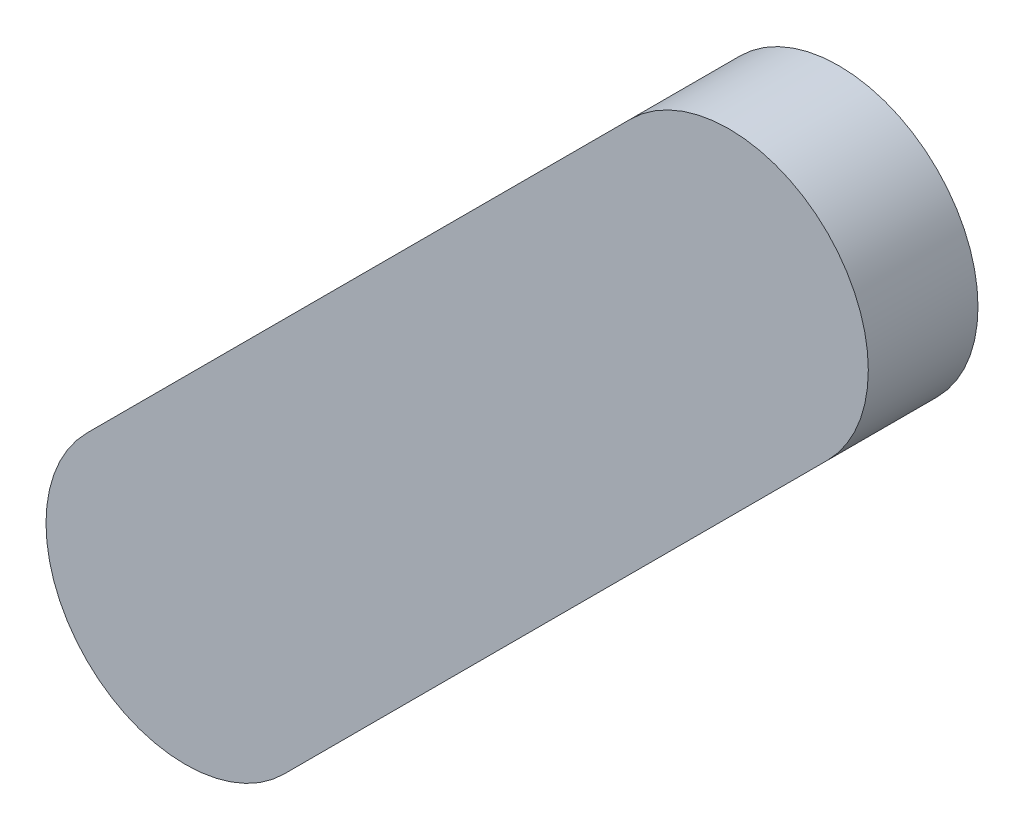
ISO-10303-21;
HEADER;
FILE_DESCRIPTION(('STEP AP214'),'2;1');
FILE_NAME('part.step','',(''),(''),'','','');
FILE_SCHEMA(('AUTOMOTIVE_DESIGN { 1 0 10303 214 1 1 1 1 }'));
ENDSEC;
DATA;
#1=APPLICATION_CONTEXT('core data for automotive mechanical design processes');
#2=APPLICATION_PROTOCOL_DEFINITION('international standard','automotive_design',2000,#1);
#3=PRODUCT_CONTEXT('',#1,'mechanical');
#4=PRODUCT('Part','Part','',(#3));
#5=PRODUCT_RELATED_PRODUCT_CATEGORY('part','',(#4));
#6=PRODUCT_DEFINITION_FORMATION('','',#4);
#7=PRODUCT_DEFINITION_CONTEXT('part definition',#1,'design');
#8=PRODUCT_DEFINITION('design','',#6,#7);
#9=PRODUCT_DEFINITION_SHAPE('','',#8);
#10=(LENGTH_UNIT() NAMED_UNIT(*) SI_UNIT(.MILLI.,.METRE.));
#11=(NAMED_UNIT(*) PLANE_ANGLE_UNIT() SI_UNIT($,.RADIAN.));
#12=(NAMED_UNIT(*) SI_UNIT($,.STERADIAN.) SOLID_ANGLE_UNIT());
#13=UNCERTAINTY_MEASURE_WITH_UNIT(LENGTH_MEASURE(1.E-05),#10,'distance_accuracy_value','');
#14=(GEOMETRIC_REPRESENTATION_CONTEXT(3) GLOBAL_UNCERTAINTY_ASSIGNED_CONTEXT((#13)) GLOBAL_UNIT_ASSIGNED_CONTEXT((#10,
#11,#12)) REPRESENTATION_CONTEXT('',''));
#15=CARTESIAN_POINT('',(0.,0.,0.));
#16=DIRECTION('',(0.,0.,1.));
#17=DIRECTION('',(1.,0.,0.));
#18=AXIS2_PLACEMENT_3D('',#15,#16,#17);
#19=CARTESIAN_POINT('',(137.4289479,64.05699406,0.));
#20=DIRECTION('',(-0.707106781186553,0.707106781186542,0.));
#21=DIRECTION('',(0.707106781186542,0.707106781186553,0.));
#22=AXIS2_PLACEMENT_3D('',#19,#20,#21);
#23=PLANE('',#22);
#24=DIRECTION('',(0.707106781186542,0.707106781186553,0.));
#25=VECTOR('',#24,1.);
#26=CARTESIAN_POINT('',(137.4289479,64.05699406,0.1999996));
#27=LINE('',#26,#25);
#28=CARTESIAN_POINT('',(137.4289479,64.05699406,0.1999996));
#29=VERTEX_POINT('',#28);
#30=CARTESIAN_POINT('',(138.42060708,65.04865324,0.1999996));
#31=VERTEX_POINT('',#30);
#32=EDGE_CURVE('E11',#29,#31,#27,.T.);
#33=ORIENTED_EDGE('',*,*,#32,.F.);
#34=DIRECTION('',(0.,0.,1.));
#35=VECTOR('',#34,1.);
#36=CARTESIAN_POINT('',(137.4289479,64.05699406,0.));
#37=LINE('',#36,#35);
#38=CARTESIAN_POINT('',(137.4289479,64.05699406,0.));
#39=VERTEX_POINT('',#38);
#40=EDGE_CURVE('E24',#39,#29,#37,.T.);
#41=ORIENTED_EDGE('',*,*,#40,.F.);
#42=DIRECTION('',(0.707106781186542,0.707106781186553,0.));
#43=VECTOR('',#42,1.);
#44=CARTESIAN_POINT('',(137.4289479,64.05699406,0.));
#45=LINE('',#44,#43);
#46=CARTESIAN_POINT('',(138.42060708,65.04865324,0.));
#47=VERTEX_POINT('',#46);
#48=EDGE_CURVE('E75',#39,#47,#45,.T.);
#49=ORIENTED_EDGE('',*,*,#48,.T.);
#50=DIRECTION('',(0.,0.,1.));
#51=VECTOR('',#50,1.);
#52=CARTESIAN_POINT('',(138.42060708,65.04865324,0.));
#53=LINE('',#52,#51);
#54=EDGE_CURVE('E37',#47,#31,#53,.T.);
#55=ORIENTED_EDGE('',*,*,#54,.T.);
#56=EDGE_LOOP('',(#33,#41,#49,#55));
#57=FACE_BOUND('',#56,.T.);
#58=ADVANCED_FACE('F17',(#57),#23,.F.);
#59=CARTESIAN_POINT('',(138.24100114,65.22825918,0.));
#60=DIRECTION('',(0.,0.,-1.));
#61=DIRECTION('',(0.707106781186576,-0.70710678118652,0.));
#62=AXIS2_PLACEMENT_3D('',#59,#60,#61);
#63=CYLINDRICAL_SURFACE('',#62,0.254001156230768);
#64=CARTESIAN_POINT('',(138.24100114,65.22825918,0.1999996));
#65=DIRECTION('',(0.,0.,1.));
#66=DIRECTION('',(0.707106781186576,-0.70710678118652,0.));
#67=AXIS2_PLACEMENT_3D('',#64,#65,#66);
#68=CIRCLE('',#67,0.254001156230768);
#69=CARTESIAN_POINT('',(138.0613952,65.40786512,0.1999996));
#70=VERTEX_POINT('',#69);
#71=EDGE_CURVE('E83',#31,#70,#68,.T.);
#72=ORIENTED_EDGE('',*,*,#71,.F.);
#73=ORIENTED_EDGE('',*,*,#54,.F.);
#74=CARTESIAN_POINT('',(138.24100114,65.22825918,0.));
#75=DIRECTION('',(0.,0.,1.));
#76=DIRECTION('',(0.707106781186576,-0.70710678118652,0.));
#77=AXIS2_PLACEMENT_3D('',#74,#75,#76);
#78=CIRCLE('',#77,0.254001156230768);
#79=CARTESIAN_POINT('',(138.0613952,65.40786512,0.));
#80=VERTEX_POINT('',#79);
#81=EDGE_CURVE('E81',#47,#80,#78,.T.);
#82=ORIENTED_EDGE('',*,*,#81,.T.);
#83=DIRECTION('',(0.,0.,1.));
#84=VECTOR('',#83,1.);
#85=CARTESIAN_POINT('',(138.0613952,65.40786512,0.));
#86=LINE('',#85,#84);
#87=EDGE_CURVE('E67',#80,#70,#86,.T.);
#88=ORIENTED_EDGE('',*,*,#87,.T.);
#89=EDGE_LOOP('',(#72,#73,#82,#88));
#90=FACE_BOUND('',#89,.T.);
#91=ADVANCED_FACE('F89',(#90),#63,.T.);
#92=CARTESIAN_POINT('',(138.0613952,65.40786512,0.));
#93=DIRECTION('',(0.707106781186548,-0.707106781186548,0.));
#94=DIRECTION('',(-0.707106781186548,-0.707106781186548,0.));
#95=AXIS2_PLACEMENT_3D('',#92,#93,#94);
#96=PLANE('',#95);
#97=DIRECTION('',(-0.707106781186548,-0.707106781186548,0.));
#98=VECTOR('',#97,1.);
#99=CARTESIAN_POINT('',(138.0613952,65.40786512,0.1999996));
#100=LINE('',#99,#98);
#101=CARTESIAN_POINT('',(137.06973602,64.41620594,0.1999996));
#102=VERTEX_POINT('',#101);
#103=EDGE_CURVE('E71',#70,#102,#100,.T.);
#104=ORIENTED_EDGE('',*,*,#103,.F.);
#105=ORIENTED_EDGE('',*,*,#87,.F.);
#106=DIRECTION('',(-0.707106781186548,-0.707106781186548,0.));
#107=VECTOR('',#106,1.);
#108=CARTESIAN_POINT('',(138.0613952,65.40786512,0.));
#109=LINE('',#108,#107);
#110=CARTESIAN_POINT('',(137.06973602,64.41620594,0.));
#111=VERTEX_POINT('',#110);
#112=EDGE_CURVE('E63',#80,#111,#109,.T.);
#113=ORIENTED_EDGE('',*,*,#112,.T.);
#114=DIRECTION('',(0.,0.,1.));
#115=VECTOR('',#114,1.);
#116=CARTESIAN_POINT('',(137.06973602,64.41620594,0.));
#117=LINE('',#116,#115);
#118=EDGE_CURVE('E53',#111,#102,#117,.T.);
#119=ORIENTED_EDGE('',*,*,#118,.T.);
#120=EDGE_LOOP('',(#104,#105,#113,#119));
#121=FACE_BOUND('',#120,.T.);
#122=ADVANCED_FACE('F66',(#121),#96,.F.);
#123=CARTESIAN_POINT('',(137.24934196,64.2366,0.));
#124=DIRECTION('',(0.,0.,-1.));
#125=DIRECTION('',(-0.70710678118652,0.707106781186576,0.));
#126=AXIS2_PLACEMENT_3D('',#123,#124,#125);
#127=CYLINDRICAL_SURFACE('',#126,0.254001156230768);
#128=CARTESIAN_POINT('',(137.24934196,64.2366,0.1999996));
#129=DIRECTION('',(0.,0.,1.));
#130=DIRECTION('',(-0.70710678118652,0.707106781186576,0.));
#131=AXIS2_PLACEMENT_3D('',#128,#129,#130);
#132=CIRCLE('',#131,0.254001156230768);
#133=EDGE_CURVE('E59',#102,#29,#132,.T.);
#134=ORIENTED_EDGE('',*,*,#133,.F.);
#135=ORIENTED_EDGE('',*,*,#118,.F.);
#136=CARTESIAN_POINT('',(137.24934196,64.2366,0.));
#137=DIRECTION('',(0.,0.,1.));
#138=DIRECTION('',(-0.70710678118652,0.707106781186576,0.));
#139=AXIS2_PLACEMENT_3D('',#136,#137,#138);
#140=CIRCLE('',#139,0.254001156230768);
#141=EDGE_CURVE('E57',#111,#39,#140,.T.);
#142=ORIENTED_EDGE('',*,*,#141,.T.);
#143=ORIENTED_EDGE('',*,*,#40,.T.);
#144=EDGE_LOOP('',(#134,#135,#142,#143));
#145=FACE_BOUND('',#144,.T.);
#146=ADVANCED_FACE('F55',(#145),#127,.T.);
#147=CARTESIAN_POINT('',(137.4289479,64.05699406,0.));
#148=DIRECTION('',(0.,0.,-1.));
#149=DIRECTION('',(-1.,0.,0.));
#150=AXIS2_PLACEMENT_3D('',#147,#148,#149);
#151=PLANE('',#150);
#152=ORIENTED_EDGE('',*,*,#141,.F.);
#153=ORIENTED_EDGE('',*,*,#112,.F.);
#154=ORIENTED_EDGE('',*,*,#81,.F.);
#155=ORIENTED_EDGE('',*,*,#48,.F.);
#156=EDGE_LOOP('',(#152,#153,#154,#155));
#157=FACE_BOUND('',#156,.T.);
#158=ADVANCED_FACE('F74',(#157),#151,.T.);
#159=CARTESIAN_POINT('',(137.4289479,64.05699406,0.1999996));
#160=DIRECTION('',(0.,0.,-1.));
#161=DIRECTION('',(-1.,0.,0.));
#162=AXIS2_PLACEMENT_3D('',#159,#160,#161);
#163=PLANE('',#162);
#164=ORIENTED_EDGE('',*,*,#32,.T.);
#165=ORIENTED_EDGE('',*,*,#71,.T.);
#166=ORIENTED_EDGE('',*,*,#103,.T.);
#167=ORIENTED_EDGE('',*,*,#133,.T.);
#168=EDGE_LOOP('',(#164,#165,#166,#167));
#169=FACE_BOUND('',#168,.T.);
#170=ADVANCED_FACE('F91',(#169),#163,.F.);
#171=CLOSED_SHELL('',(#58,#91,#122,#146,#158,#170));
#172=MANIFOLD_SOLID_BREP('B1',#171);
#173=ADVANCED_BREP_SHAPE_REPRESENTATION('',(#18,#172),#14);
#174=SHAPE_DEFINITION_REPRESENTATION(#9,#173);
ENDSEC;
END-ISO-10303-21;
